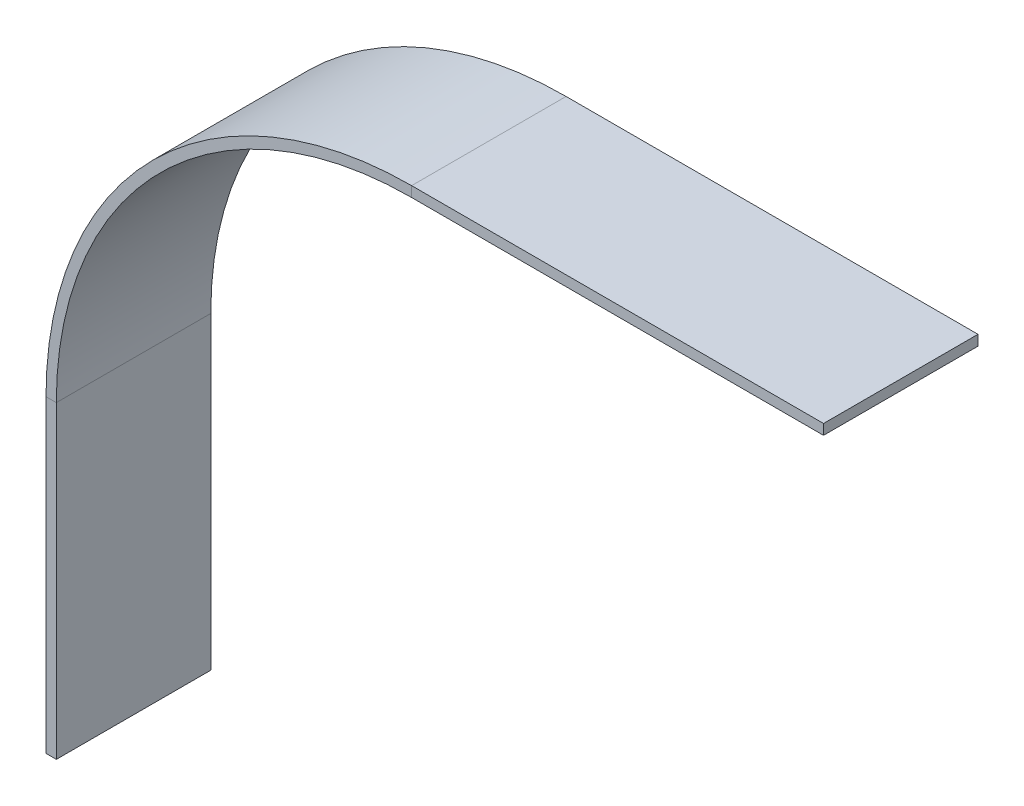
ISO-10303-21;
HEADER;
FILE_DESCRIPTION(('STEP AP214'),'2;1');
FILE_NAME('part.step','',(''),(''),'','','');
FILE_SCHEMA(('AUTOMOTIVE_DESIGN { 1 0 10303 214 1 1 1 1 }'));
ENDSEC;
DATA;
#1=APPLICATION_CONTEXT('core data for automotive mechanical design processes');
#2=APPLICATION_PROTOCOL_DEFINITION('international standard','automotive_design',2000,#1);
#3=PRODUCT_CONTEXT('',#1,'mechanical');
#4=PRODUCT('Part','Part','',(#3));
#5=PRODUCT_RELATED_PRODUCT_CATEGORY('part','',(#4));
#6=PRODUCT_DEFINITION_FORMATION('','',#4);
#7=PRODUCT_DEFINITION_CONTEXT('part definition',#1,'design');
#8=PRODUCT_DEFINITION('design','',#6,#7);
#9=PRODUCT_DEFINITION_SHAPE('','',#8);
#10=(LENGTH_UNIT() NAMED_UNIT(*) SI_UNIT(.MILLI.,.METRE.));
#11=(NAMED_UNIT(*) PLANE_ANGLE_UNIT() SI_UNIT($,.RADIAN.));
#12=(NAMED_UNIT(*) SI_UNIT($,.STERADIAN.) SOLID_ANGLE_UNIT());
#13=UNCERTAINTY_MEASURE_WITH_UNIT(LENGTH_MEASURE(1.E-05),#10,'distance_accuracy_value','');
#14=(GEOMETRIC_REPRESENTATION_CONTEXT(3) GLOBAL_UNCERTAINTY_ASSIGNED_CONTEXT((#13)) GLOBAL_UNIT_ASSIGNED_CONTEXT((#10,
#11,#12)) REPRESENTATION_CONTEXT('',''));
#15=CARTESIAN_POINT('',(0.,0.,0.));
#16=DIRECTION('',(0.,0.,1.));
#17=DIRECTION('',(1.,0.,0.));
#18=AXIS2_PLACEMENT_3D('',#15,#16,#17);
#19=CARTESIAN_POINT('',(40.0000000438611,64.5018732024312,-7.5));
#20=DIRECTION('',(0.,0.,-1.));
#21=DIRECTION('',(-1.,0.,0.));
#22=AXIS2_PLACEMENT_3D('',#19,#20,#21);
#23=PLANE('',#22);
#24=DIRECTION('',(4.68300607944781E-05,0.999999998903473,0.));
#25=VECTOR('',#24,1.);
#26=CARTESIAN_POINT('',(40.0000000438611,64.5018732024312,-7.5));
#27=LINE('',#26,#25);
#28=CARTESIAN_POINT('',(40.0000000438611,64.5018732024312,-7.5));
#29=VERTEX_POINT('',#28);
#30=CARTESIAN_POINT('',(40.0000468739219,65.5018732013347,-7.5));
#31=VERTEX_POINT('',#30);
#32=EDGE_CURVE('E12',#29,#31,#27,.T.);
#33=ORIENTED_EDGE('',*,*,#32,.F.);
#34=CARTESIAN_POINT('',(39.9983842976418,29.9995430623967,-7.5));
#35=DIRECTION('',(0.,0.,-1.));
#36=DIRECTION('',(-1.,0.,0.));
#37=AXIS2_PLACEMENT_3D('',#34,#35,#36);
#38=CIRCLE('',#37,34.5023301778672);
#39=CARTESIAN_POINT('',(5.49605412279684,29.9999997405009,-7.5));
#40=VERTEX_POINT('',#39);
#41=EDGE_CURVE('E175',#40,#29,#38,.T.);
#42=ORIENTED_EDGE('',*,*,#41,.F.);
#43=DIRECTION('',(0.999999999912402,-1.32361509982411E-05,0.));
#44=VECTOR('',#43,1.);
#45=CARTESIAN_POINT('',(4.49605411240593,30.000012976652,-7.5));
#46=LINE('',#45,#44);
#47=CARTESIAN_POINT('',(4.49605411240593,30.000012976652,-7.5));
#48=VERTEX_POINT('',#47);
#49=EDGE_CURVE('E63',#48,#40,#46,.T.);
#50=ORIENTED_EDGE('',*,*,#49,.F.);
#51=CARTESIAN_POINT('',(39.9983842976418,29.9995430623967,-7.5));
#52=DIRECTION('',(0.,0.,1.));
#53=DIRECTION('',(1.,0.,0.));
#54=AXIS2_PLACEMENT_3D('',#51,#52,#53);
#55=CIRCLE('',#54,35.5023301778673);
#56=EDGE_CURVE('E231',#48,#31,#55,.F.);
#57=ORIENTED_EDGE('',*,*,#56,.T.);
#58=EDGE_LOOP('',(#33,#42,#50,#57));
#59=FACE_BOUND('',#58,.T.);
#60=ADVANCED_FACE('F53',(#59),#23,.T.);
#61=CARTESIAN_POINT('',(4.49605411240593,30.000012976652,-7.5));
#62=DIRECTION('',(0.,0.,-1.));
#63=DIRECTION('',(-1.,0.,0.));
#64=AXIS2_PLACEMENT_3D('',#61,#62,#63);
#65=PLANE('',#64);
#66=DIRECTION('',(0.999999998903473,-4.68300607809474E-05,0.));
#67=VECTOR('',#66,1.);
#68=CARTESIAN_POINT('',(80.,64.5,-7.5));
#69=LINE('',#68,#67);
#70=CARTESIAN_POINT('',(80.,64.5,-7.5));
#71=VERTEX_POINT('',#70);
#72=EDGE_CURVE('E242',#29,#71,#69,.T.);
#73=ORIENTED_EDGE('',*,*,#72,.F.);
#74=ORIENTED_EDGE('',*,*,#32,.T.);
#75=DIRECTION('',(0.999999998903473,-4.68300607809474E-05,0.));
#76=VECTOR('',#75,1.);
#77=CARTESIAN_POINT('',(80.0000468300608,65.4999999989035,-7.5));
#78=LINE('',#77,#76);
#79=CARTESIAN_POINT('',(80.0000468300608,65.4999999989035,-7.5));
#80=VERTEX_POINT('',#79);
#81=EDGE_CURVE('E234',#31,#80,#78,.T.);
#82=ORIENTED_EDGE('',*,*,#81,.T.);
#83=DIRECTION('',(-4.68300607875393E-05,-0.999999998903473,0.));
#84=VECTOR('',#83,1.);
#85=CARTESIAN_POINT('',(80.0000468300608,65.4999999989035,-7.5));
#86=LINE('',#85,#84);
#87=EDGE_CURVE('E132',#80,#71,#86,.T.);
#88=ORIENTED_EDGE('',*,*,#87,.T.);
#89=EDGE_LOOP('',(#73,#74,#82,#88));
#90=FACE_BOUND('',#89,.T.);
#91=ADVANCED_FACE('F298',(#90),#65,.T.);
#92=CARTESIAN_POINT('',(5.49605412279684,29.9999997405009,7.5));
#93=DIRECTION('',(0.,0.,1.));
#94=DIRECTION('',(1.,0.,0.));
#95=AXIS2_PLACEMENT_3D('',#92,#93,#94);
#96=PLANE('',#95);
#97=DIRECTION('',(-0.999999999912402,1.32361509982411E-05,0.));
#98=VECTOR('',#97,1.);
#99=CARTESIAN_POINT('',(5.49605412279684,29.9999997405009,7.5));
#100=LINE('',#99,#98);
#101=CARTESIAN_POINT('',(5.49605412279684,29.9999997405009,7.5));
#102=VERTEX_POINT('',#101);
#103=CARTESIAN_POINT('',(4.49605411240593,30.000012976652,7.5));
#104=VERTEX_POINT('',#103);
#105=EDGE_CURVE('E111',#102,#104,#100,.T.);
#106=ORIENTED_EDGE('',*,*,#105,.F.);
#107=CARTESIAN_POINT('',(39.9983842976418,29.9995430623967,7.5));
#108=DIRECTION('',(0.,0.,-1.));
#109=DIRECTION('',(-1.,0.,0.));
#110=AXIS2_PLACEMENT_3D('',#107,#108,#109);
#111=CIRCLE('',#110,34.5023301778672);
#112=CARTESIAN_POINT('',(40.0000000438611,64.5018732024312,7.5));
#113=VERTEX_POINT('',#112);
#114=EDGE_CURVE('E200',#102,#113,#111,.T.);
#115=ORIENTED_EDGE('',*,*,#114,.T.);
#116=DIRECTION('',(-4.68300607944781E-05,-0.999999998903473,0.));
#117=VECTOR('',#116,1.);
#118=CARTESIAN_POINT('',(40.0000468739219,65.5018732013347,7.5));
#119=LINE('',#118,#117);
#120=CARTESIAN_POINT('',(40.0000468739219,65.5018732013347,7.5));
#121=VERTEX_POINT('',#120);
#122=EDGE_CURVE('E121',#121,#113,#119,.T.);
#123=ORIENTED_EDGE('',*,*,#122,.F.);
#124=CARTESIAN_POINT('',(39.9983842976418,29.9995430623967,7.5));
#125=DIRECTION('',(0.,0.,1.));
#126=DIRECTION('',(1.,0.,0.));
#127=AXIS2_PLACEMENT_3D('',#124,#125,#126);
#128=CIRCLE('',#127,35.5023301778673);
#129=EDGE_CURVE('E223',#104,#121,#128,.F.);
#130=ORIENTED_EDGE('',*,*,#129,.F.);
#131=EDGE_LOOP('',(#106,#115,#123,#130));
#132=FACE_BOUND('',#131,.T.);
#133=ADVANCED_FACE('F250',(#132),#96,.T.);
#134=CARTESIAN_POINT('',(40.0000468739219,65.5018732013347,7.5));
#135=DIRECTION('',(0.,0.,1.));
#136=DIRECTION('',(1.,0.,0.));
#137=AXIS2_PLACEMENT_3D('',#134,#135,#136);
#138=PLANE('',#137);
#139=DIRECTION('',(-0.000131529240105186,0.999999991350029,0.));
#140=VECTOR('',#139,1.);
#141=CARTESIAN_POINT('',(5.5,0.,7.5));
#142=LINE('',#141,#140);
#143=CARTESIAN_POINT('',(5.5,0.,7.5));
#144=VERTEX_POINT('',#143);
#145=EDGE_CURVE('E155',#144,#102,#142,.T.);
#146=ORIENTED_EDGE('',*,*,#145,.T.);
#147=ORIENTED_EDGE('',*,*,#105,.T.);
#148=DIRECTION('',(-0.000131529240105186,0.999999991350029,0.));
#149=VECTOR('',#148,1.);
#150=CARTESIAN_POINT('',(4.50000000864997,-0.000131529240105186,7.5));
#151=LINE('',#150,#149);
#152=CARTESIAN_POINT('',(4.50000000864997,-0.000131529240105186,7.5));
#153=VERTEX_POINT('',#152);
#154=EDGE_CURVE('E218',#153,#104,#151,.T.);
#155=ORIENTED_EDGE('',*,*,#154,.F.);
#156=DIRECTION('',(-0.999999991350029,-0.000131529240105186,0.));
#157=VECTOR('',#156,1.);
#158=CARTESIAN_POINT('',(5.5,0.,7.5));
#159=LINE('',#158,#157);
#160=EDGE_CURVE('E215',#144,#153,#159,.T.);
#161=ORIENTED_EDGE('',*,*,#160,.F.);
#162=EDGE_LOOP('',(#146,#147,#155,#161));
#163=FACE_BOUND('',#162,.T.);
#164=ADVANCED_FACE('F305',(#163),#138,.T.);
#165=CARTESIAN_POINT('',(80.,64.5,-7.5));
#166=DIRECTION('',(-4.68300607809474E-05,-0.999999998903473,0.));
#167=DIRECTION('',(0.999999998903473,-4.68300607809474E-05,0.));
#168=AXIS2_PLACEMENT_3D('',#165,#166,#167);
#169=PLANE('',#168);
#170=DIRECTION('',(0.999999998903473,-4.68300607809474E-05,0.));
#171=VECTOR('',#170,1.);
#172=CARTESIAN_POINT('',(80.,64.5,7.5));
#173=LINE('',#172,#171);
#174=CARTESIAN_POINT('',(80.,64.5,7.5));
#175=VERTEX_POINT('',#174);
#176=EDGE_CURVE('E184',#113,#175,#173,.T.);
#177=ORIENTED_EDGE('',*,*,#176,.F.);
#178=DIRECTION('',(0.,0.,1.));
#179=VECTOR('',#178,1.);
#180=CARTESIAN_POINT('',(40.0000000438611,64.5018732024312,-7.5));
#181=LINE('',#180,#179);
#182=EDGE_CURVE('E196',#29,#113,#181,.T.);
#183=ORIENTED_EDGE('',*,*,#182,.F.);
#184=ORIENTED_EDGE('',*,*,#72,.T.);
#185=DIRECTION('',(0.,0.,1.));
#186=VECTOR('',#185,1.);
#187=CARTESIAN_POINT('',(80.,64.5,-7.5));
#188=LINE('',#187,#186);
#189=EDGE_CURVE('E178',#71,#175,#188,.T.);
#190=ORIENTED_EDGE('',*,*,#189,.T.);
#191=EDGE_LOOP('',(#177,#183,#184,#190));
#192=FACE_BOUND('',#191,.T.);
#193=ADVANCED_FACE('F255',(#192),#169,.T.);
#194=CARTESIAN_POINT('',(39.9983842976418,29.9995430623967,-7.5));
#195=DIRECTION('',(0.,0.,1.));
#196=DIRECTION('',(1.,0.,0.));
#197=AXIS2_PLACEMENT_3D('',#194,#195,#196);
#198=CYLINDRICAL_SURFACE('',#197,34.5023301778672);
#199=ORIENTED_EDGE('',*,*,#114,.F.);
#200=DIRECTION('',(0.,0.,1.));
#201=VECTOR('',#200,1.);
#202=CARTESIAN_POINT('',(5.49605412279684,29.9999997405009,-7.5));
#203=LINE('',#202,#201);
#204=EDGE_CURVE('E159',#40,#102,#203,.T.);
#205=ORIENTED_EDGE('',*,*,#204,.F.);
#206=ORIENTED_EDGE('',*,*,#41,.T.);
#207=ORIENTED_EDGE('',*,*,#182,.T.);
#208=EDGE_LOOP('',(#199,#205,#206,#207));
#209=FACE_BOUND('',#208,.T.);
#210=ADVANCED_FACE('F253',(#209),#198,.F.);
#211=CARTESIAN_POINT('',(5.5,0.,-7.5));
#212=DIRECTION('',(0.999999991350029,0.000131529240105186,0.));
#213=DIRECTION('',(-0.000131529240105186,0.99999999135003,0.));
#214=AXIS2_PLACEMENT_3D('',#211,#212,#213);
#215=PLANE('',#214);
#216=ORIENTED_EDGE('',*,*,#145,.F.);
#217=DIRECTION('',(0.,0.,1.));
#218=VECTOR('',#217,1.);
#219=CARTESIAN_POINT('',(5.5,0.,-7.5));
#220=LINE('',#219,#218);
#221=CARTESIAN_POINT('',(5.5,0.,-7.5));
#222=VERTEX_POINT('',#221);
#223=EDGE_CURVE('E149',#222,#144,#220,.T.);
#224=ORIENTED_EDGE('',*,*,#223,.F.);
#225=DIRECTION('',(-0.000131529240105186,0.999999991350029,0.));
#226=VECTOR('',#225,1.);
#227=CARTESIAN_POINT('',(5.5,0.,-7.5));
#228=LINE('',#227,#226);
#229=EDGE_CURVE('E153',#222,#40,#228,.T.);
#230=ORIENTED_EDGE('',*,*,#229,.T.);
#231=ORIENTED_EDGE('',*,*,#204,.T.);
#232=EDGE_LOOP('',(#216,#224,#230,#231));
#233=FACE_BOUND('',#232,.T.);
#234=ADVANCED_FACE('F151',(#233),#215,.T.);
#235=CARTESIAN_POINT('',(5.5,0.,-7.5));
#236=DIRECTION('',(-0.000131529240105186,0.999999991350029,0.));
#237=DIRECTION('',(-0.999999991350029,-0.000131529240105186,0.));
#238=AXIS2_PLACEMENT_3D('',#235,#236,#237);
#239=PLANE('',#238);
#240=ORIENTED_EDGE('',*,*,#160,.T.);
#241=DIRECTION('',(0.,0.,1.));
#242=VECTOR('',#241,1.);
#243=CARTESIAN_POINT('',(4.50000000864997,-0.000131529240105186,-7.5));
#244=LINE('',#243,#242);
#245=CARTESIAN_POINT('',(4.50000000864997,-0.000131529240105186,-7.5));
#246=VERTEX_POINT('',#245);
#247=EDGE_CURVE('E160',#246,#153,#244,.T.);
#248=ORIENTED_EDGE('',*,*,#247,.F.);
#249=DIRECTION('',(-0.999999991350029,-0.000131529240105186,0.));
#250=VECTOR('',#249,1.);
#251=CARTESIAN_POINT('',(5.5,0.,-7.5));
#252=LINE('',#251,#250);
#253=EDGE_CURVE('E163',#222,#246,#252,.T.);
#254=ORIENTED_EDGE('',*,*,#253,.F.);
#255=ORIENTED_EDGE('',*,*,#223,.T.);
#256=EDGE_LOOP('',(#240,#248,#254,#255));
#257=FACE_BOUND('',#256,.T.);
#258=ADVANCED_FACE('F164',(#257),#239,.F.);
#259=CARTESIAN_POINT('',(4.50000000864997,-0.000131529240105186,-7.5));
#260=DIRECTION('',(0.999999991350029,0.000131529240105186,0.));
#261=DIRECTION('',(-0.000131529240105186,0.999999991350029,0.));
#262=AXIS2_PLACEMENT_3D('',#259,#260,#261);
#263=PLANE('',#262);
#264=ORIENTED_EDGE('',*,*,#154,.T.);
#265=DIRECTION('',(0.,0.,1.));
#266=VECTOR('',#265,1.);
#267=CARTESIAN_POINT('',(4.49605411240593,30.000012976652,-7.5));
#268=LINE('',#267,#266);
#269=EDGE_CURVE('E282',#48,#104,#268,.T.);
#270=ORIENTED_EDGE('',*,*,#269,.F.);
#271=DIRECTION('',(-0.000131529240105186,0.999999991350029,0.));
#272=VECTOR('',#271,1.);
#273=CARTESIAN_POINT('',(4.50000000864997,-0.000131529240105186,-7.5));
#274=LINE('',#273,#272);
#275=EDGE_CURVE('E170',#246,#48,#274,.T.);
#276=ORIENTED_EDGE('',*,*,#275,.F.);
#277=ORIENTED_EDGE('',*,*,#247,.T.);
#278=EDGE_LOOP('',(#264,#270,#276,#277));
#279=FACE_BOUND('',#278,.T.);
#280=ADVANCED_FACE('F326',(#279),#263,.F.);
#281=CARTESIAN_POINT('',(39.9983842976418,29.9995430623967,-7.5));
#282=DIRECTION('',(0.,0.,1.));
#283=DIRECTION('',(1.,0.,0.));
#284=AXIS2_PLACEMENT_3D('',#281,#282,#283);
#285=CYLINDRICAL_SURFACE('',#284,35.5023301778673);
#286=ORIENTED_EDGE('',*,*,#129,.T.);
#287=DIRECTION('',(0.,0.,1.));
#288=VECTOR('',#287,1.);
#289=CARTESIAN_POINT('',(40.0000468739219,65.5018732013347,-7.5));
#290=LINE('',#289,#288);
#291=EDGE_CURVE('E279',#31,#121,#290,.T.);
#292=ORIENTED_EDGE('',*,*,#291,.F.);
#293=ORIENTED_EDGE('',*,*,#56,.F.);
#294=ORIENTED_EDGE('',*,*,#269,.T.);
#295=EDGE_LOOP('',(#286,#292,#293,#294));
#296=FACE_BOUND('',#295,.T.);
#297=ADVANCED_FACE('F277',(#296),#285,.T.);
#298=CARTESIAN_POINT('',(80.0000468300608,65.4999999989035,-7.5));
#299=DIRECTION('',(-4.68300607809474E-05,-0.999999998903473,0.));
#300=DIRECTION('',(0.999999998903473,-4.68300607809474E-05,0.));
#301=AXIS2_PLACEMENT_3D('',#298,#299,#300);
#302=PLANE('',#301);
#303=DIRECTION('',(0.999999998903473,-4.68300607809474E-05,0.));
#304=VECTOR('',#303,1.);
#305=CARTESIAN_POINT('',(80.0000468300608,65.4999999989035,7.5));
#306=LINE('',#305,#304);
#307=CARTESIAN_POINT('',(80.0000468300608,65.4999999989035,7.5));
#308=VERTEX_POINT('',#307);
#309=EDGE_CURVE('E263',#121,#308,#306,.T.);
#310=ORIENTED_EDGE('',*,*,#309,.T.);
#311=DIRECTION('',(0.,0.,1.));
#312=VECTOR('',#311,1.);
#313=CARTESIAN_POINT('',(80.0000468300608,65.4999999989035,-7.5));
#314=LINE('',#313,#312);
#315=EDGE_CURVE('E286',#80,#308,#314,.T.);
#316=ORIENTED_EDGE('',*,*,#315,.F.);
#317=ORIENTED_EDGE('',*,*,#81,.F.);
#318=ORIENTED_EDGE('',*,*,#291,.T.);
#319=EDGE_LOOP('',(#310,#316,#317,#318));
#320=FACE_BOUND('',#319,.T.);
#321=ADVANCED_FACE('F284',(#320),#302,.F.);
#322=CARTESIAN_POINT('',(80.0000468300608,65.4999999989035,-7.5));
#323=DIRECTION('',(-0.999999998903473,4.68300607875393E-05,0.));
#324=DIRECTION('',(-4.68300607875393E-05,-0.999999998903473,0.));
#325=AXIS2_PLACEMENT_3D('',#322,#323,#324);
#326=PLANE('',#325);
#327=DIRECTION('',(-4.68300607875393E-05,-0.999999998903473,0.));
#328=VECTOR('',#327,1.);
#329=CARTESIAN_POINT('',(80.0000468300608,65.4999999989035,7.5));
#330=LINE('',#329,#328);
#331=EDGE_CURVE('E259',#308,#175,#330,.T.);
#332=ORIENTED_EDGE('',*,*,#331,.T.);
#333=ORIENTED_EDGE('',*,*,#189,.F.);
#334=ORIENTED_EDGE('',*,*,#87,.F.);
#335=ORIENTED_EDGE('',*,*,#315,.T.);
#336=EDGE_LOOP('',(#332,#333,#334,#335));
#337=FACE_BOUND('',#336,.T.);
#338=ADVANCED_FACE('F294',(#337),#326,.F.);
#339=CARTESIAN_POINT('',(39.9983842976418,29.9995430623967,-7.5));
#340=DIRECTION('',(0.,0.,1.));
#341=DIRECTION('',(1.,0.,0.));
#342=AXIS2_PLACEMENT_3D('',#339,#340,#341);
#343=PLANE('',#342);
#344=ORIENTED_EDGE('',*,*,#275,.T.);
#345=ORIENTED_EDGE('',*,*,#49,.T.);
#346=ORIENTED_EDGE('',*,*,#229,.F.);
#347=ORIENTED_EDGE('',*,*,#253,.T.);
#348=EDGE_LOOP('',(#344,#345,#346,#347));
#349=FACE_BOUND('',#348,.T.);
#350=ADVANCED_FACE('F172',(#349),#343,.F.);
#351=CARTESIAN_POINT('',(39.9983842976418,29.9995430623967,7.5));
#352=DIRECTION('',(0.,0.,1.));
#353=DIRECTION('',(1.,0.,0.));
#354=AXIS2_PLACEMENT_3D('',#351,#352,#353);
#355=PLANE('',#354);
#356=ORIENTED_EDGE('',*,*,#176,.T.);
#357=ORIENTED_EDGE('',*,*,#331,.F.);
#358=ORIENTED_EDGE('',*,*,#309,.F.);
#359=ORIENTED_EDGE('',*,*,#122,.T.);
#360=EDGE_LOOP('',(#356,#357,#358,#359));
#361=FACE_BOUND('',#360,.T.);
#362=ADVANCED_FACE('F288',(#361),#355,.T.);
#363=CLOSED_SHELL('',(#60,#91,#133,#164,#193,#210,#234,#258,#280,#297,#321,#338,#350,#362));
#364=MANIFOLD_SOLID_BREP('B2',#363);
#365=ADVANCED_BREP_SHAPE_REPRESENTATION('',(#18,#364),#14);
#366=SHAPE_DEFINITION_REPRESENTATION(#9,#365);
ENDSEC;
END-ISO-10303-21;
